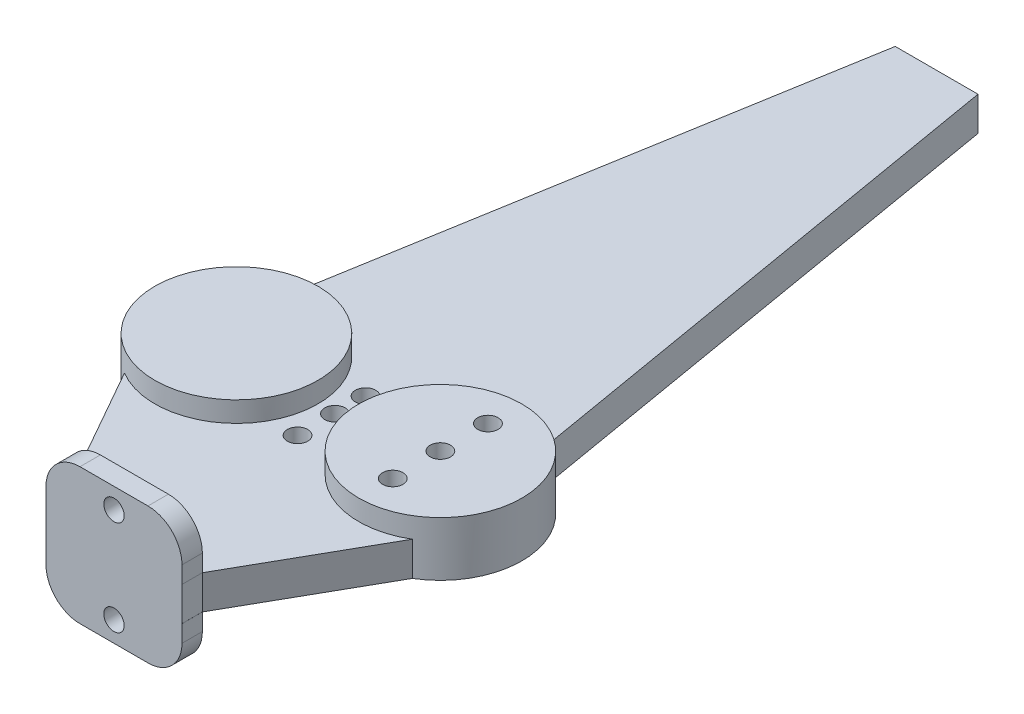
ISO-10303-21;
HEADER;
FILE_DESCRIPTION(('STEP AP214'),'2;1');
FILE_NAME('part.step','',(''),(''),'','','');
FILE_SCHEMA(('AUTOMOTIVE_DESIGN { 1 0 10303 214 1 1 1 1 }'));
ENDSEC;
DATA;
#1=APPLICATION_CONTEXT('core data for automotive mechanical design processes');
#2=APPLICATION_PROTOCOL_DEFINITION('international standard','automotive_design',2000,#1);
#3=PRODUCT_CONTEXT('',#1,'mechanical');
#4=PRODUCT('Part','Part','',(#3));
#5=PRODUCT_RELATED_PRODUCT_CATEGORY('part','',(#4));
#6=PRODUCT_DEFINITION_FORMATION('','',#4);
#7=PRODUCT_DEFINITION_CONTEXT('part definition',#1,'design');
#8=PRODUCT_DEFINITION('design','',#6,#7);
#9=PRODUCT_DEFINITION_SHAPE('','',#8);
#10=(LENGTH_UNIT() NAMED_UNIT(*) SI_UNIT(.MILLI.,.METRE.));
#11=(NAMED_UNIT(*) PLANE_ANGLE_UNIT() SI_UNIT($,.RADIAN.));
#12=(NAMED_UNIT(*) SI_UNIT($,.STERADIAN.) SOLID_ANGLE_UNIT());
#13=UNCERTAINTY_MEASURE_WITH_UNIT(LENGTH_MEASURE(1.E-05),#10,'distance_accuracy_value','');
#14=(GEOMETRIC_REPRESENTATION_CONTEXT(3) GLOBAL_UNCERTAINTY_ASSIGNED_CONTEXT((#13)) GLOBAL_UNIT_ASSIGNED_CONTEXT((#10,
#11,#12)) REPRESENTATION_CONTEXT('',''));
#15=CARTESIAN_POINT('',(0.,0.,0.));
#16=DIRECTION('',(0.,0.,1.));
#17=DIRECTION('',(1.,0.,0.));
#18=AXIS2_PLACEMENT_3D('',#15,#16,#17);
#19=CARTESIAN_POINT('',(0.,0.,62.));
#20=DIRECTION('',(0.,1.,0.));
#21=DIRECTION('',(0.,0.,1.));
#22=AXIS2_PLACEMENT_3D('',#19,#20,#21);
#23=PLANE('',#22);
#24=DIRECTION('',(1.,0.,0.));
#25=VECTOR('',#24,1.);
#26=CARTESIAN_POINT('',(0.,0.,59.));
#27=LINE('',#26,#25);
#28=CARTESIAN_POINT('',(9.98550356432979,0.,59.));
#29=VERTEX_POINT('',#28);
#30=CARTESIAN_POINT('',(9.9927517821649,0.,59.));
#31=VERTEX_POINT('',#30);
#32=EDGE_CURVE('E145',#29,#31,#27,.T.);
#33=ORIENTED_EDGE('',*,*,#32,.F.);
#34=DIRECTION('',(0.,0.,-1.));
#35=VECTOR('',#34,1.);
#36=CARTESIAN_POINT('',(9.98550356432979,0.,62.));
#37=LINE('',#36,#35);
#38=CARTESIAN_POINT('',(9.98550356432979,0.,62.));
#39=VERTEX_POINT('',#38);
#40=EDGE_CURVE('E140',#39,#29,#37,.T.);
#41=ORIENTED_EDGE('',*,*,#40,.F.);
#42=DIRECTION('',(1.,0.,0.));
#43=VECTOR('',#42,1.);
#44=CARTESIAN_POINT('',(0.,0.,62.));
#45=LINE('',#44,#43);
#46=CARTESIAN_POINT('',(9.9927517821649,0.,62.));
#47=VERTEX_POINT('',#46);
#48=EDGE_CURVE('E142',#39,#47,#45,.T.);
#49=ORIENTED_EDGE('',*,*,#48,.T.);
#50=DIRECTION('',(0.,0.,-1.));
#51=VECTOR('',#50,1.);
#52=CARTESIAN_POINT('',(9.9927517821649,0.,62.));
#53=LINE('',#52,#51);
#54=EDGE_CURVE('E195',#47,#31,#53,.T.);
#55=ORIENTED_EDGE('',*,*,#54,.T.);
#56=EDGE_LOOP('',(#33,#41,#49,#55));
#57=FACE_BOUND('',#56,.T.);
#58=ADVANCED_FACE('F50',(#57),#23,.T.);
#59=CARTESIAN_POINT('',(9.98550356432979,0.,62.));
#60=DIRECTION('',(1.,0.,0.));
#61=DIRECTION('',(0.,0.,-1.));
#62=AXIS2_PLACEMENT_3D('',#59,#60,#61);
#63=PLANE('',#62);
#64=DIRECTION('',(0.,-1.,0.));
#65=VECTOR('',#64,1.);
#66=CARTESIAN_POINT('',(9.98550356432979,0.,59.));
#67=LINE('',#66,#65);
#68=CARTESIAN_POINT('',(9.98550356432979,5.,59.));
#69=VERTEX_POINT('',#68);
#70=EDGE_CURVE('E179',#69,#29,#67,.T.);
#71=ORIENTED_EDGE('',*,*,#70,.F.);
#72=DIRECTION('',(0.,0.,-1.));
#73=VECTOR('',#72,1.);
#74=CARTESIAN_POINT('',(9.98550356432979,5.,62.));
#75=LINE('',#74,#73);
#76=CARTESIAN_POINT('',(9.98550356432979,5.,62.));
#77=VERTEX_POINT('',#76);
#78=EDGE_CURVE('E151',#77,#69,#75,.T.);
#79=ORIENTED_EDGE('',*,*,#78,.F.);
#80=DIRECTION('',(0.,-1.,0.));
#81=VECTOR('',#80,1.);
#82=CARTESIAN_POINT('',(9.98550356432979,0.,62.));
#83=LINE('',#82,#81);
#84=EDGE_CURVE('E157',#77,#39,#83,.T.);
#85=ORIENTED_EDGE('',*,*,#84,.T.);
#86=ORIENTED_EDGE('',*,*,#40,.T.);
#87=EDGE_LOOP('',(#71,#79,#85,#86));
#88=FACE_BOUND('',#87,.T.);
#89=ADVANCED_FACE('F163',(#88),#63,.T.);
#90=CARTESIAN_POINT('',(0.,5.,62.));
#91=DIRECTION('',(0.,-1.,0.));
#92=DIRECTION('',(0.,0.,-1.));
#93=AXIS2_PLACEMENT_3D('',#90,#91,#92);
#94=PLANE('',#93);
#95=DIRECTION('',(-1.,0.,0.));
#96=VECTOR('',#95,1.);
#97=CARTESIAN_POINT('',(0.,5.,59.));
#98=LINE('',#97,#96);
#99=CARTESIAN_POINT('',(9.9927517821649,5.,59.));
#100=VERTEX_POINT('',#99);
#101=EDGE_CURVE('E182',#100,#69,#98,.T.);
#102=ORIENTED_EDGE('',*,*,#101,.F.);
#103=DIRECTION('',(0.,0.,-1.));
#104=VECTOR('',#103,1.);
#105=CARTESIAN_POINT('',(9.9927517821649,5.,62.));
#106=LINE('',#105,#104);
#107=CARTESIAN_POINT('',(9.9927517821649,5.,62.));
#108=VERTEX_POINT('',#107);
#109=EDGE_CURVE('E197',#108,#100,#106,.T.);
#110=ORIENTED_EDGE('',*,*,#109,.F.);
#111=DIRECTION('',(-1.,0.,0.));
#112=VECTOR('',#111,1.);
#113=CARTESIAN_POINT('',(0.,5.,62.));
#114=LINE('',#113,#112);
#115=EDGE_CURVE('E164',#108,#77,#114,.T.);
#116=ORIENTED_EDGE('',*,*,#115,.T.);
#117=ORIENTED_EDGE('',*,*,#78,.T.);
#118=EDGE_LOOP('',(#102,#110,#116,#117));
#119=FACE_BOUND('',#118,.T.);
#120=ADVANCED_FACE('F263',(#119),#94,.T.);
#121=CARTESIAN_POINT('',(9.9927517821649,0.,62.));
#122=DIRECTION('',(1.,0.,0.));
#123=DIRECTION('',(0.,0.,-1.));
#124=AXIS2_PLACEMENT_3D('',#121,#122,#123);
#125=PLANE('',#124);
#126=DIRECTION('',(0.,-1.,0.));
#127=VECTOR('',#126,1.);
#128=CARTESIAN_POINT('',(9.9927517821649,0.,59.));
#129=LINE('',#128,#127);
#130=CARTESIAN_POINT('',(9.9927517821649,7.5,59.));
#131=VERTEX_POINT('',#130);
#132=EDGE_CURVE('E185',#131,#100,#129,.T.);
#133=ORIENTED_EDGE('',*,*,#132,.F.);
#134=DIRECTION('',(0.,0.,-1.));
#135=VECTOR('',#134,1.);
#136=CARTESIAN_POINT('',(9.9927517821649,7.5,62.));
#137=LINE('',#136,#135);
#138=CARTESIAN_POINT('',(9.9927517821649,7.5,62.));
#139=VERTEX_POINT('',#138);
#140=EDGE_CURVE('E12',#131,#139,#137,.F.);
#141=ORIENTED_EDGE('',*,*,#140,.T.);
#142=DIRECTION('',(0.,-1.,0.));
#143=VECTOR('',#142,1.);
#144=CARTESIAN_POINT('',(9.9927517821649,0.,62.));
#145=LINE('',#144,#143);
#146=EDGE_CURVE('E166',#139,#108,#145,.T.);
#147=ORIENTED_EDGE('',*,*,#146,.T.);
#148=ORIENTED_EDGE('',*,*,#109,.T.);
#149=EDGE_LOOP('',(#133,#141,#147,#148));
#150=FACE_BOUND('',#149,.T.);
#151=ADVANCED_FACE('F268',(#150),#125,.T.);
#152=CARTESIAN_POINT('',(0.,12.5,62.));
#153=DIRECTION('',(0.,1.,0.));
#154=DIRECTION('',(0.,0.,1.));
#155=AXIS2_PLACEMENT_3D('',#152,#153,#154);
#156=PLANE('',#155);
#157=DIRECTION('',(1.,0.,0.));
#158=VECTOR('',#157,1.);
#159=CARTESIAN_POINT('',(0.,12.5,62.));
#160=LINE('',#159,#158);
#161=CARTESIAN_POINT('',(-5.0072482178351,12.5,62.));
#162=VERTEX_POINT('',#161);
#163=CARTESIAN_POINT('',(4.9927517821649,12.5,62.));
#164=VERTEX_POINT('',#163);
#165=EDGE_CURVE('E171',#162,#164,#160,.T.);
#166=ORIENTED_EDGE('',*,*,#165,.T.);
#167=DIRECTION('',(0.,0.,-1.));
#168=VECTOR('',#167,1.);
#169=CARTESIAN_POINT('',(4.9927517821649,12.5,62.));
#170=LINE('',#169,#168);
#171=CARTESIAN_POINT('',(4.9927517821649,12.5,59.));
#172=VERTEX_POINT('',#171);
#173=EDGE_CURVE('E58',#164,#172,#170,.T.);
#174=ORIENTED_EDGE('',*,*,#173,.T.);
#175=DIRECTION('',(1.,0.,0.));
#176=VECTOR('',#175,1.);
#177=CARTESIAN_POINT('',(0.,12.5,59.));
#178=LINE('',#177,#176);
#179=CARTESIAN_POINT('',(-5.0072482178351,12.5,59.));
#180=VERTEX_POINT('',#179);
#181=EDGE_CURVE('E187',#180,#172,#178,.T.);
#182=ORIENTED_EDGE('',*,*,#181,.F.);
#183=DIRECTION('',(0.,0.,-1.));
#184=VECTOR('',#183,1.);
#185=CARTESIAN_POINT('',(-5.0072482178351,12.5,62.));
#186=LINE('',#185,#184);
#187=EDGE_CURVE('E227',#180,#162,#186,.F.);
#188=ORIENTED_EDGE('',*,*,#187,.T.);
#189=EDGE_LOOP('',(#166,#174,#182,#188));
#190=FACE_BOUND('',#189,.T.);
#191=ADVANCED_FACE('F232',(#190),#156,.T.);
#192=CARTESIAN_POINT('',(-10.0072482178351,0.,62.));
#193=DIRECTION('',(1.,0.,0.));
#194=DIRECTION('',(0.,1.,0.));
#195=AXIS2_PLACEMENT_3D('',#192,#193,#194);
#196=PLANE('',#195);
#197=DIRECTION('',(0.,-1.,0.));
#198=VECTOR('',#197,1.);
#199=CARTESIAN_POINT('',(-10.0072482178351,0.,59.));
#200=LINE('',#199,#198);
#201=CARTESIAN_POINT('',(-10.0072482178351,7.5,59.));
#202=VERTEX_POINT('',#201);
#203=CARTESIAN_POINT('',(-10.0072482178351,-2.5,59.));
#204=VERTEX_POINT('',#203);
#205=EDGE_CURVE('E190',#202,#204,#200,.T.);
#206=ORIENTED_EDGE('',*,*,#205,.T.);
#207=DIRECTION('',(0.,0.,-1.));
#208=VECTOR('',#207,1.);
#209=CARTESIAN_POINT('',(-10.0072482178351,-2.5,62.));
#210=LINE('',#209,#208);
#211=CARTESIAN_POINT('',(-10.0072482178351,-2.5,62.));
#212=VERTEX_POINT('',#211);
#213=EDGE_CURVE('E65',#204,#212,#210,.F.);
#214=ORIENTED_EDGE('',*,*,#213,.T.);
#215=DIRECTION('',(0.,-1.,0.));
#216=VECTOR('',#215,1.);
#217=CARTESIAN_POINT('',(-10.0072482178351,0.,62.));
#218=LINE('',#217,#216);
#219=CARTESIAN_POINT('',(-10.0072482178351,7.5,62.));
#220=VERTEX_POINT('',#219);
#221=EDGE_CURVE('E174',#220,#212,#218,.T.);
#222=ORIENTED_EDGE('',*,*,#221,.F.);
#223=DIRECTION('',(0.,0.,-1.));
#224=VECTOR('',#223,1.);
#225=CARTESIAN_POINT('',(-10.0072482178351,7.5,59.));
#226=LINE('',#225,#224);
#227=EDGE_CURVE('E223',#220,#202,#226,.T.);
#228=ORIENTED_EDGE('',*,*,#227,.T.);
#229=EDGE_LOOP('',(#206,#214,#222,#228));
#230=FACE_BOUND('',#229,.T.);
#231=ADVANCED_FACE('F243',(#230),#196,.F.);
#232=CARTESIAN_POINT('',(0.,-7.5,62.));
#233=DIRECTION('',(0.,1.,0.));
#234=DIRECTION('',(0.,0.,1.));
#235=AXIS2_PLACEMENT_3D('',#232,#233,#234);
#236=PLANE('',#235);
#237=DIRECTION('',(1.,0.,0.));
#238=VECTOR('',#237,1.);
#239=CARTESIAN_POINT('',(0.,-7.5,59.));
#240=LINE('',#239,#238);
#241=CARTESIAN_POINT('',(-5.0072482178351,-7.5,59.));
#242=VERTEX_POINT('',#241);
#243=CARTESIAN_POINT('',(4.9927517821649,-7.5,59.));
#244=VERTEX_POINT('',#243);
#245=EDGE_CURVE('E192',#242,#244,#240,.T.);
#246=ORIENTED_EDGE('',*,*,#245,.T.);
#247=DIRECTION('',(0.,0.,-1.));
#248=VECTOR('',#247,1.);
#249=CARTESIAN_POINT('',(4.9927517821649,-7.5,62.));
#250=LINE('',#249,#248);
#251=CARTESIAN_POINT('',(4.9927517821649,-7.5,62.));
#252=VERTEX_POINT('',#251);
#253=EDGE_CURVE('E214',#244,#252,#250,.F.);
#254=ORIENTED_EDGE('',*,*,#253,.T.);
#255=DIRECTION('',(1.,0.,0.));
#256=VECTOR('',#255,1.);
#257=CARTESIAN_POINT('',(0.,-7.5,62.));
#258=LINE('',#257,#256);
#259=CARTESIAN_POINT('',(-5.0072482178351,-7.5,62.));
#260=VERTEX_POINT('',#259);
#261=EDGE_CURVE('E176',#260,#252,#258,.T.);
#262=ORIENTED_EDGE('',*,*,#261,.F.);
#263=DIRECTION('',(0.,0.,-1.));
#264=VECTOR('',#263,1.);
#265=CARTESIAN_POINT('',(-5.0072482178351,-7.5,62.));
#266=LINE('',#265,#264);
#267=EDGE_CURVE('E211',#260,#242,#266,.T.);
#268=ORIENTED_EDGE('',*,*,#267,.T.);
#269=EDGE_LOOP('',(#246,#254,#262,#268));
#270=FACE_BOUND('',#269,.T.);
#271=ADVANCED_FACE('F251',(#270),#236,.F.);
#272=CARTESIAN_POINT('',(9.9927517821649,-2.5,62.));
#273=VERTEX_POINT('',#272);
#274=EDGE_CURVE('E160',#47,#273,#145,.T.);
#275=ORIENTED_EDGE('',*,*,#274,.T.);
#276=DIRECTION('',(0.,0.,-1.));
#277=VECTOR('',#276,1.);
#278=CARTESIAN_POINT('',(9.9927517821649,-2.5,59.));
#279=LINE('',#278,#277);
#280=CARTESIAN_POINT('',(9.9927517821649,-2.5,59.));
#281=VERTEX_POINT('',#280);
#282=EDGE_CURVE('E150',#273,#281,#279,.T.);
#283=ORIENTED_EDGE('',*,*,#282,.T.);
#284=EDGE_CURVE('E161',#31,#281,#129,.T.);
#285=ORIENTED_EDGE('',*,*,#284,.F.);
#286=ORIENTED_EDGE('',*,*,#54,.F.);
#287=EDGE_LOOP('',(#275,#283,#285,#286));
#288=FACE_BOUND('',#287,.T.);
#289=ADVANCED_FACE('F259',(#288),#125,.T.);
#290=CARTESIAN_POINT('',(0.,0.,62.));
#291=DIRECTION('',(0.,0.,1.));
#292=DIRECTION('',(1.,0.,0.));
#293=AXIS2_PLACEMENT_3D('',#290,#291,#292);
#294=PLANE('',#293);
#295=CARTESIAN_POINT('',(-0.00724821783510202,9.5,62.));
#296=DIRECTION('',(0.,0.,1.));
#297=DIRECTION('',(1.,0.,0.));
#298=AXIS2_PLACEMENT_3D('',#295,#296,#297);
#299=CIRCLE('',#298,1.49999999999999);
#300=CARTESIAN_POINT('',(1.49275178216489,9.5,62.));
#301=VERTEX_POINT('',#300);
#302=EDGE_CURVE('E322',#301,#301,#299,.T.);
#303=ORIENTED_EDGE('',*,*,#302,.F.);
#304=EDGE_LOOP('',(#303));
#305=FACE_BOUND('',#304,.T.);
#306=CARTESIAN_POINT('',(-0.00724821783510202,-4.5,62.));
#307=DIRECTION('',(0.,0.,1.));
#308=DIRECTION('',(1.,0.,0.));
#309=AXIS2_PLACEMENT_3D('',#306,#307,#308);
#310=CIRCLE('',#309,1.49999999999999);
#311=CARTESIAN_POINT('',(1.49275178216489,-4.5,62.));
#312=VERTEX_POINT('',#311);
#313=EDGE_CURVE('E180',#312,#312,#310,.T.);
#314=ORIENTED_EDGE('',*,*,#313,.F.);
#315=EDGE_LOOP('',(#314));
#316=FACE_BOUND('',#315,.T.);
#317=ORIENTED_EDGE('',*,*,#261,.T.);
#318=CARTESIAN_POINT('',(4.9927517821649,-2.5,62.));
#319=DIRECTION('',(0.,0.,1.));
#320=DIRECTION('',(1.,0.,0.));
#321=AXIS2_PLACEMENT_3D('',#318,#319,#320);
#322=CIRCLE('',#321,5.);
#323=EDGE_CURVE('E221',#252,#273,#322,.T.);
#324=ORIENTED_EDGE('',*,*,#323,.T.);
#325=ORIENTED_EDGE('',*,*,#274,.F.);
#326=ORIENTED_EDGE('',*,*,#48,.F.);
#327=ORIENTED_EDGE('',*,*,#84,.F.);
#328=ORIENTED_EDGE('',*,*,#115,.F.);
#329=ORIENTED_EDGE('',*,*,#146,.F.);
#330=CARTESIAN_POINT('',(4.9927517821649,7.5,62.));
#331=DIRECTION('',(0.,0.,1.));
#332=DIRECTION('',(1.,0.,0.));
#333=AXIS2_PLACEMENT_3D('',#330,#331,#332);
#334=CIRCLE('',#333,5.);
#335=EDGE_CURVE('E217',#139,#164,#334,.T.);
#336=ORIENTED_EDGE('',*,*,#335,.T.);
#337=ORIENTED_EDGE('',*,*,#165,.F.);
#338=CARTESIAN_POINT('',(-5.0072482178351,7.5,62.));
#339=DIRECTION('',(0.,0.,1.));
#340=DIRECTION('',(1.,0.,0.));
#341=AXIS2_PLACEMENT_3D('',#338,#339,#340);
#342=CIRCLE('',#341,5.);
#343=EDGE_CURVE('E72',#162,#220,#342,.T.);
#344=ORIENTED_EDGE('',*,*,#343,.T.);
#345=ORIENTED_EDGE('',*,*,#221,.T.);
#346=CARTESIAN_POINT('',(-5.0072482178351,-2.5,62.));
#347=DIRECTION('',(0.,0.,1.));
#348=DIRECTION('',(1.,0.,0.));
#349=AXIS2_PLACEMENT_3D('',#346,#347,#348);
#350=CIRCLE('',#349,5.);
#351=EDGE_CURVE('E219',#212,#260,#350,.T.);
#352=ORIENTED_EDGE('',*,*,#351,.T.);
#353=EDGE_LOOP('',(#317,#324,#325,#326,#327,#328,#329,#336,#337,#344,#345,#352));
#354=FACE_BOUND('',#353,.T.);
#355=ADVANCED_FACE('F155',(#305,#316,#354),#294,.T.);
#356=CARTESIAN_POINT('',(0.,0.,59.));
#357=DIRECTION('',(0.,0.,1.));
#358=DIRECTION('',(1.,0.,0.));
#359=AXIS2_PLACEMENT_3D('',#356,#357,#358);
#360=PLANE('',#359);
#361=CARTESIAN_POINT('',(-0.00724821783510202,9.5,59.));
#362=DIRECTION('',(0.,0.,-1.));
#363=DIRECTION('',(-1.,0.,0.));
#364=AXIS2_PLACEMENT_3D('',#361,#362,#363);
#365=CIRCLE('',#364,1.49999999999999);
#366=CARTESIAN_POINT('',(-1.50724821783509,9.5,59.));
#367=VERTEX_POINT('',#366);
#368=EDGE_CURVE('E318',#367,#367,#365,.T.);
#369=ORIENTED_EDGE('',*,*,#368,.F.);
#370=EDGE_LOOP('',(#369));
#371=FACE_BOUND('',#370,.T.);
#372=CARTESIAN_POINT('',(-0.00724821783510202,-4.5,59.));
#373=DIRECTION('',(0.,0.,-1.));
#374=DIRECTION('',(-1.,0.,0.));
#375=AXIS2_PLACEMENT_3D('',#372,#373,#374);
#376=CIRCLE('',#375,1.49999999999999);
#377=CARTESIAN_POINT('',(-1.50724821783509,-4.5,59.));
#378=VERTEX_POINT('',#377);
#379=EDGE_CURVE('E321',#378,#378,#376,.T.);
#380=ORIENTED_EDGE('',*,*,#379,.F.);
#381=EDGE_LOOP('',(#380));
#382=FACE_BOUND('',#381,.T.);
#383=ORIENTED_EDGE('',*,*,#284,.T.);
#384=CARTESIAN_POINT('',(4.9927517821649,-2.5,59.));
#385=DIRECTION('',(0.,0.,1.));
#386=DIRECTION('',(1.,0.,0.));
#387=AXIS2_PLACEMENT_3D('',#384,#385,#386);
#388=CIRCLE('',#387,5.);
#389=EDGE_CURVE('E209',#281,#244,#388,.F.);
#390=ORIENTED_EDGE('',*,*,#389,.T.);
#391=ORIENTED_EDGE('',*,*,#245,.F.);
#392=CARTESIAN_POINT('',(-5.0072482178351,-2.5,59.));
#393=DIRECTION('',(0.,0.,1.));
#394=DIRECTION('',(1.,0.,0.));
#395=AXIS2_PLACEMENT_3D('',#392,#393,#394);
#396=CIRCLE('',#395,5.);
#397=EDGE_CURVE('E207',#242,#204,#396,.F.);
#398=ORIENTED_EDGE('',*,*,#397,.T.);
#399=ORIENTED_EDGE('',*,*,#205,.F.);
#400=CARTESIAN_POINT('',(-5.0072482178351,7.5,59.));
#401=DIRECTION('',(0.,0.,1.));
#402=DIRECTION('',(1.,0.,0.));
#403=AXIS2_PLACEMENT_3D('',#400,#401,#402);
#404=CIRCLE('',#403,5.);
#405=EDGE_CURVE('E203',#202,#180,#404,.F.);
#406=ORIENTED_EDGE('',*,*,#405,.T.);
#407=ORIENTED_EDGE('',*,*,#181,.T.);
#408=CARTESIAN_POINT('',(4.9927517821649,7.5,59.));
#409=DIRECTION('',(0.,0.,1.));
#410=DIRECTION('',(1.,0.,0.));
#411=AXIS2_PLACEMENT_3D('',#408,#409,#410);
#412=CIRCLE('',#411,5.);
#413=EDGE_CURVE('E205',#172,#131,#412,.F.);
#414=ORIENTED_EDGE('',*,*,#413,.T.);
#415=ORIENTED_EDGE('',*,*,#132,.T.);
#416=ORIENTED_EDGE('',*,*,#101,.T.);
#417=ORIENTED_EDGE('',*,*,#70,.T.);
#418=ORIENTED_EDGE('',*,*,#32,.T.);
#419=EDGE_LOOP('',(#383,#390,#391,#398,#399,#406,#407,#414,#415,#416,#417,#418));
#420=FACE_BOUND('',#419,.T.);
#421=ADVANCED_FACE('F238',(#371,#382,#420),#360,.F.);
#422=CARTESIAN_POINT('',(4.9927517821649,-2.5,62.));
#423=DIRECTION('',(0.,0.,1.));
#424=DIRECTION('',(1.,0.,0.));
#425=AXIS2_PLACEMENT_3D('',#422,#423,#424);
#426=CYLINDRICAL_SURFACE('',#425,5.);
#427=ORIENTED_EDGE('',*,*,#323,.F.);
#428=ORIENTED_EDGE('',*,*,#253,.F.);
#429=ORIENTED_EDGE('',*,*,#389,.F.);
#430=ORIENTED_EDGE('',*,*,#282,.F.);
#431=EDGE_LOOP('',(#427,#428,#429,#430));
#432=FACE_BOUND('',#431,.T.);
#433=ADVANCED_FACE('F257',(#432),#426,.T.);
#434=CARTESIAN_POINT('',(-5.0072482178351,-2.5,62.));
#435=DIRECTION('',(0.,0.,-1.));
#436=DIRECTION('',(-1.,0.,0.));
#437=AXIS2_PLACEMENT_3D('',#434,#435,#436);
#438=CYLINDRICAL_SURFACE('',#437,5.);
#439=ORIENTED_EDGE('',*,*,#351,.F.);
#440=ORIENTED_EDGE('',*,*,#213,.F.);
#441=ORIENTED_EDGE('',*,*,#397,.F.);
#442=ORIENTED_EDGE('',*,*,#267,.F.);
#443=EDGE_LOOP('',(#439,#440,#441,#442));
#444=FACE_BOUND('',#443,.T.);
#445=ADVANCED_FACE('F248',(#444),#438,.T.);
#446=CARTESIAN_POINT('',(4.9927517821649,7.5,62.));
#447=DIRECTION('',(0.,0.,-1.));
#448=DIRECTION('',(-1.,0.,0.));
#449=AXIS2_PLACEMENT_3D('',#446,#447,#448);
#450=CYLINDRICAL_SURFACE('',#449,5.);
#451=ORIENTED_EDGE('',*,*,#335,.F.);
#452=ORIENTED_EDGE('',*,*,#140,.F.);
#453=ORIENTED_EDGE('',*,*,#413,.F.);
#454=ORIENTED_EDGE('',*,*,#173,.F.);
#455=EDGE_LOOP('',(#451,#452,#453,#454));
#456=FACE_BOUND('',#455,.T.);
#457=ADVANCED_FACE('F267',(#456),#450,.T.);
#458=CARTESIAN_POINT('',(-5.0072482178351,7.5,62.));
#459=DIRECTION('',(0.,0.,1.));
#460=DIRECTION('',(1.,0.,0.));
#461=AXIS2_PLACEMENT_3D('',#458,#459,#460);
#462=CYLINDRICAL_SURFACE('',#461,5.);
#463=ORIENTED_EDGE('',*,*,#343,.F.);
#464=ORIENTED_EDGE('',*,*,#187,.F.);
#465=ORIENTED_EDGE('',*,*,#405,.F.);
#466=ORIENTED_EDGE('',*,*,#227,.F.);
#467=EDGE_LOOP('',(#463,#464,#465,#466));
#468=FACE_BOUND('',#467,.T.);
#469=ADVANCED_FACE('F52',(#468),#462,.T.);
#470=CARTESIAN_POINT('',(-0.00724821783510202,-4.5,59.));
#471=DIRECTION('',(0.,0.,-1.));
#472=DIRECTION('',(-1.,0.,0.));
#473=AXIS2_PLACEMENT_3D('',#470,#471,#472);
#474=CYLINDRICAL_SURFACE('',#473,1.49999999999999);
#475=ORIENTED_EDGE('',*,*,#313,.T.);
#476=EDGE_LOOP('',(#475));
#477=FACE_BOUND('',#476,.T.);
#478=ORIENTED_EDGE('',*,*,#379,.T.);
#479=EDGE_LOOP('',(#478));
#480=FACE_BOUND('',#479,.T.);
#481=ADVANCED_FACE('F294',(#477,#480),#474,.F.);
#482=CARTESIAN_POINT('',(-0.00724821783510202,9.5,59.));
#483=DIRECTION('',(0.,0.,-1.));
#484=DIRECTION('',(-1.,0.,0.));
#485=AXIS2_PLACEMENT_3D('',#482,#483,#484);
#486=CYLINDRICAL_SURFACE('',#485,1.49999999999999);
#487=ORIENTED_EDGE('',*,*,#302,.T.);
#488=EDGE_LOOP('',(#487));
#489=FACE_BOUND('',#488,.T.);
#490=ORIENTED_EDGE('',*,*,#368,.T.);
#491=EDGE_LOOP('',(#490));
#492=FACE_BOUND('',#491,.T.);
#493=ADVANCED_FACE('F298',(#489,#492),#486,.F.);
#494=CLOSED_SHELL('',(#58,#89,#120,#151,#191,#231,#271,#289,#355,#421,#433,#445,#457,#469,#481,#493));
#495=MANIFOLD_SOLID_BREP('B2',#494);
#496=CARTESIAN_POINT('',(-32.8763666947014,5.,18.6299411269975));
#497=DIRECTION('',(0.870022185848612,0.,-0.49301257198088));
#498=DIRECTION('',(-0.49301257198088,0.,-0.870022185848612));
#499=AXIS2_PLACEMENT_3D('',#496,#497,#498);
#500=PLANE('',#499);
#501=DIRECTION('',(0.49301257198088,0.,0.870022185848612));
#502=VECTOR('',#501,1.);
#503=CARTESIAN_POINT('',(-32.8763666947014,0.,18.6299411269975));
#504=LINE('',#503,#502);
#505=CARTESIAN_POINT('',(-21.1665264928511,0.,39.2943650126157));
#506=VERTEX_POINT('',#505);
#507=CARTESIAN_POINT('',(-9.99999999999999,0.,59.));
#508=VERTEX_POINT('',#507);
#509=EDGE_CURVE('E532',#506,#508,#504,.T.);
#510=ORIENTED_EDGE('',*,*,#509,.T.);
#511=DIRECTION('',(0.,-1.,0.));
#512=VECTOR('',#511,1.);
#513=CARTESIAN_POINT('',(-9.99999999999999,5.,59.));
#514=LINE('',#513,#512);
#515=CARTESIAN_POINT('',(-9.99999999999999,5.,59.));
#516=VERTEX_POINT('',#515);
#517=EDGE_CURVE('E574',#516,#508,#514,.T.);
#518=ORIENTED_EDGE('',*,*,#517,.F.);
#519=DIRECTION('',(0.49301257198088,0.,0.870022185848612));
#520=VECTOR('',#519,1.);
#521=CARTESIAN_POINT('',(-32.8763666947014,5.,18.6299411269975));
#522=LINE('',#521,#520);
#523=CARTESIAN_POINT('',(-21.1665264928511,5.,39.2943650126157));
#524=VERTEX_POINT('',#523);
#525=EDGE_CURVE('E558',#524,#516,#522,.T.);
#526=ORIENTED_EDGE('',*,*,#525,.F.);
#527=DIRECTION('',(0.,-1.,0.));
#528=VECTOR('',#527,1.);
#529=CARTESIAN_POINT('',(-21.1665264928511,5.,39.2943650126157));
#530=LINE('',#529,#528);
#531=EDGE_CURVE('E528',#524,#506,#530,.T.);
#532=ORIENTED_EDGE('',*,*,#531,.T.);
#533=EDGE_LOOP('',(#510,#518,#526,#532));
#534=FACE_BOUND('',#533,.T.);
#535=ADVANCED_FACE('F426',(#534),#500,.F.);
#536=CARTESIAN_POINT('',(0.,5.,59.));
#537=DIRECTION('',(0.,0.,-1.));
#538=DIRECTION('',(-1.,0.,0.));
#539=AXIS2_PLACEMENT_3D('',#536,#537,#538);
#540=PLANE('',#539);
#541=DIRECTION('',(1.,0.,0.));
#542=VECTOR('',#541,1.);
#543=CARTESIAN_POINT('',(0.,0.,59.));
#544=LINE('',#543,#542);
#545=CARTESIAN_POINT('',(10.,0.,59.));
#546=VERTEX_POINT('',#545);
#547=EDGE_CURVE('E536',#508,#546,#544,.T.);
#548=ORIENTED_EDGE('',*,*,#547,.T.);
#549=DIRECTION('',(0.,-1.,0.));
#550=VECTOR('',#549,1.);
#551=CARTESIAN_POINT('',(10.,5.,59.));
#552=LINE('',#551,#550);
#553=CARTESIAN_POINT('',(10.,5.,59.));
#554=VERTEX_POINT('',#553);
#555=EDGE_CURVE('E571',#554,#546,#552,.T.);
#556=ORIENTED_EDGE('',*,*,#555,.F.);
#557=DIRECTION('',(1.,0.,0.));
#558=VECTOR('',#557,1.);
#559=CARTESIAN_POINT('',(0.,5.,59.));
#560=LINE('',#559,#558);
#561=EDGE_CURVE('E488',#516,#554,#560,.T.);
#562=ORIENTED_EDGE('',*,*,#561,.F.);
#563=ORIENTED_EDGE('',*,*,#517,.T.);
#564=EDGE_LOOP('',(#548,#556,#562,#563));
#565=FACE_BOUND('',#564,.T.);
#566=ADVANCED_FACE('F650',(#565),#540,.F.);
#567=CARTESIAN_POINT('',(32.8763666947013,5.,18.6299411269971));
#568=DIRECTION('',(0.870022185848616,0.,0.493012571980874));
#569=DIRECTION('',(0.493012571980874,0.,-0.870022185848616));
#570=AXIS2_PLACEMENT_3D('',#567,#568,#569);
#571=PLANE('',#570);
#572=DIRECTION('',(-0.493012571980874,0.,0.870022185848616));
#573=VECTOR('',#572,1.);
#574=CARTESIAN_POINT('',(32.8763666947013,0.,18.6299411269971));
#575=LINE('',#574,#573);
#576=CARTESIAN_POINT('',(21.166526492851,0.,39.2943650126157));
#577=VERTEX_POINT('',#576);
#578=EDGE_CURVE('E541',#577,#546,#575,.T.);
#579=ORIENTED_EDGE('',*,*,#578,.F.);
#580=DIRECTION('',(0.,-1.,0.));
#581=VECTOR('',#580,1.);
#582=CARTESIAN_POINT('',(21.166526492851,5.,39.2943650126157));
#583=LINE('',#582,#581);
#584=CARTESIAN_POINT('',(21.1665264928509,5.,39.2943650126157));
#585=VERTEX_POINT('',#584);
#586=EDGE_CURVE('E568',#585,#577,#583,.T.);
#587=ORIENTED_EDGE('',*,*,#586,.F.);
#588=DIRECTION('',(-0.493012571980874,0.,0.870022185848616));
#589=VECTOR('',#588,1.);
#590=CARTESIAN_POINT('',(32.8763666947013,5.,18.6299411269971));
#591=LINE('',#590,#589);
#592=EDGE_CURVE('E520',#585,#554,#591,.T.);
#593=ORIENTED_EDGE('',*,*,#592,.T.);
#594=ORIENTED_EDGE('',*,*,#555,.T.);
#595=EDGE_LOOP('',(#579,#587,#593,#594));
#596=FACE_BOUND('',#595,.T.);
#597=ADVANCED_FACE('F635',(#596),#571,.T.);
#598=CARTESIAN_POINT('',(15.,5.,29.));
#599=DIRECTION('',(0.,-1.,0.));
#600=DIRECTION('',(0.,0.,-1.));
#601=AXIS2_PLACEMENT_3D('',#598,#599,#600);
#602=CYLINDRICAL_SURFACE('',#601,12.);
#603=CARTESIAN_POINT('',(15.,0.,29.));
#604=DIRECTION('',(0.,1.,0.));
#605=DIRECTION('',(0.,0.,1.));
#606=AXIS2_PLACEMENT_3D('',#603,#604,#605);
#607=CIRCLE('',#606,12.);
#608=CARTESIAN_POINT('',(19.1684611875596,0.,17.747270049992));
#609=VERTEX_POINT('',#608);
#610=EDGE_CURVE('E545',#577,#609,#607,.T.);
#611=ORIENTED_EDGE('',*,*,#610,.T.);
#612=DIRECTION('',(0.,-1.,0.));
#613=VECTOR('',#612,1.);
#614=CARTESIAN_POINT('',(19.1684611875596,5.,17.747270049992));
#615=LINE('',#614,#613);
#616=CARTESIAN_POINT('',(19.1684611875596,5.,17.747270049992));
#617=VERTEX_POINT('',#616);
#618=EDGE_CURVE('E510',#617,#609,#615,.T.);
#619=ORIENTED_EDGE('',*,*,#618,.F.);
#620=CARTESIAN_POINT('',(15.,5.,29.));
#621=DIRECTION('',(0.,1.,0.));
#622=DIRECTION('',(0.,0.,1.));
#623=AXIS2_PLACEMENT_3D('',#620,#621,#622);
#624=CIRCLE('',#623,11.9999999999999);
#625=EDGE_CURVE('E436',#617,#585,#624,.T.);
#626=ORIENTED_EDGE('',*,*,#625,.T.);
#627=ORIENTED_EDGE('',*,*,#586,.T.);
#628=EDGE_LOOP('',(#611,#619,#626,#627));
#629=FACE_BOUND('',#628,.T.);
#630=CARTESIAN_POINT('',(15.,8.,29.));
#631=DIRECTION('',(0.,1.,0.));
#632=DIRECTION('',(0.,0.,1.));
#633=AXIS2_PLACEMENT_3D('',#630,#631,#632);
#634=CIRCLE('',#633,11.9999999999999);
#635=CARTESIAN_POINT('',(15.,8.,41.));
#636=VERTEX_POINT('',#635);
#637=EDGE_CURVE('E537',#636,#636,#634,.T.);
#638=ORIENTED_EDGE('',*,*,#637,.F.);
#639=EDGE_LOOP('',(#638));
#640=FACE_BOUND('',#639,.T.);
#641=ADVANCED_FACE('F661',(#629,#640),#602,.T.);
#642=CARTESIAN_POINT('',(15.6875601669558,5.,-2.67401593754936));
#643=DIRECTION('',(0.985781716034392,0.,-0.168030974324049));
#644=DIRECTION('',(-0.168030974324049,0.,-0.985781716034392));
#645=AXIS2_PLACEMENT_3D('',#642,#643,#644);
#646=PLANE('',#645);
#647=DIRECTION('',(0.168030974324049,0.,0.985781716034392));
#648=VECTOR('',#647,1.);
#649=CARTESIAN_POINT('',(15.6875601669558,0.,-2.67401593754936));
#650=LINE('',#649,#648);
#651=CARTESIAN_POINT('',(6.08654015631057,0.,-59.));
#652=VERTEX_POINT('',#651);
#653=EDGE_CURVE('E504',#652,#609,#650,.T.);
#654=ORIENTED_EDGE('',*,*,#653,.F.);
#655=DIRECTION('',(0.,-1.,0.));
#656=VECTOR('',#655,1.);
#657=CARTESIAN_POINT('',(6.08654015631057,5.,-59.));
#658=LINE('',#657,#656);
#659=CARTESIAN_POINT('',(6.08654015631057,5.,-59.));
#660=VERTEX_POINT('',#659);
#661=EDGE_CURVE('E499',#660,#652,#658,.T.);
#662=ORIENTED_EDGE('',*,*,#661,.F.);
#663=DIRECTION('',(0.168030974324049,0.,0.985781716034392));
#664=VECTOR('',#663,1.);
#665=CARTESIAN_POINT('',(15.6875601669558,5.,-2.67401593754936));
#666=LINE('',#665,#664);
#667=EDGE_CURVE('E502',#660,#617,#666,.T.);
#668=ORIENTED_EDGE('',*,*,#667,.T.);
#669=ORIENTED_EDGE('',*,*,#618,.T.);
#670=EDGE_LOOP('',(#654,#662,#668,#669));
#671=FACE_BOUND('',#670,.T.);
#672=ADVANCED_FACE('F501',(#671),#646,.T.);
#673=CARTESIAN_POINT('',(0.,5.,-59.));
#674=DIRECTION('',(0.,0.,-1.));
#675=DIRECTION('',(-1.,0.,0.));
#676=AXIS2_PLACEMENT_3D('',#673,#674,#675);
#677=PLANE('',#676);
#678=DIRECTION('',(1.,0.,0.));
#679=VECTOR('',#678,1.);
#680=CARTESIAN_POINT('',(0.,0.,-59.));
#681=LINE('',#680,#679);
#682=CARTESIAN_POINT('',(-6.0865401563105,0.,-59.));
#683=VERTEX_POINT('',#682);
#684=EDGE_CURVE('E551',#683,#652,#681,.T.);
#685=ORIENTED_EDGE('',*,*,#684,.F.);
#686=DIRECTION('',(0.,-1.,0.));
#687=VECTOR('',#686,1.);
#688=CARTESIAN_POINT('',(-6.0865401563105,5.,-59.));
#689=LINE('',#688,#687);
#690=CARTESIAN_POINT('',(-6.0865401563105,5.,-59.));
#691=VERTEX_POINT('',#690);
#692=EDGE_CURVE('E511',#691,#683,#689,.T.);
#693=ORIENTED_EDGE('',*,*,#692,.F.);
#694=DIRECTION('',(1.,0.,0.));
#695=VECTOR('',#694,1.);
#696=CARTESIAN_POINT('',(0.,5.,-59.));
#697=LINE('',#696,#695);
#698=EDGE_CURVE('E515',#691,#660,#697,.T.);
#699=ORIENTED_EDGE('',*,*,#698,.T.);
#700=ORIENTED_EDGE('',*,*,#661,.T.);
#701=EDGE_LOOP('',(#685,#693,#699,#700));
#702=FACE_BOUND('',#701,.T.);
#703=ADVANCED_FACE('F522',(#702),#677,.T.);
#704=CARTESIAN_POINT('',(-15.6875601669555,5.,-2.67401593754923));
#705=DIRECTION('',(0.985781716034393,0.,0.168030974324044));
#706=DIRECTION('',(0.168030974324044,0.,-0.985781716034393));
#707=AXIS2_PLACEMENT_3D('',#704,#705,#706);
#708=PLANE('',#707);
#709=DIRECTION('',(-0.168030974324044,0.,0.985781716034393));
#710=VECTOR('',#709,1.);
#711=CARTESIAN_POINT('',(-15.6875601669555,0.,-2.67401593754923));
#712=LINE('',#711,#710);
#713=CARTESIAN_POINT('',(-19.1684611875591,0.,17.7472700499917));
#714=VERTEX_POINT('',#713);
#715=EDGE_CURVE('E473',#683,#714,#712,.T.);
#716=ORIENTED_EDGE('',*,*,#715,.T.);
#717=DIRECTION('',(0.,-1.,0.));
#718=VECTOR('',#717,1.);
#719=CARTESIAN_POINT('',(-19.1684611875591,5.,17.7472700499917));
#720=LINE('',#719,#718);
#721=CARTESIAN_POINT('',(-19.1684611875591,5.,17.7472700499917));
#722=VERTEX_POINT('',#721);
#723=EDGE_CURVE('E561',#722,#714,#720,.T.);
#724=ORIENTED_EDGE('',*,*,#723,.F.);
#725=DIRECTION('',(-0.168030974324044,0.,0.985781716034393));
#726=VECTOR('',#725,1.);
#727=CARTESIAN_POINT('',(-15.6875601669555,5.,-2.67401593754923));
#728=LINE('',#727,#726);
#729=EDGE_CURVE('E525',#691,#722,#728,.T.);
#730=ORIENTED_EDGE('',*,*,#729,.F.);
#731=ORIENTED_EDGE('',*,*,#692,.T.);
#732=EDGE_LOOP('',(#716,#724,#730,#731));
#733=FACE_BOUND('',#732,.T.);
#734=ADVANCED_FACE('F640',(#733),#708,.F.);
#735=CARTESIAN_POINT('',(-15.,5.,29.));
#736=DIRECTION('',(0.,-1.,0.));
#737=DIRECTION('',(0.,0.,-1.));
#738=AXIS2_PLACEMENT_3D('',#735,#736,#737);
#739=CYLINDRICAL_SURFACE('',#738,12.);
#740=CARTESIAN_POINT('',(-15.,0.,29.));
#741=DIRECTION('',(0.,1.,0.));
#742=DIRECTION('',(0.,0.,1.));
#743=AXIS2_PLACEMENT_3D('',#740,#741,#742);
#744=CIRCLE('',#743,12.);
#745=EDGE_CURVE('E479',#714,#506,#744,.T.);
#746=ORIENTED_EDGE('',*,*,#745,.T.);
#747=ORIENTED_EDGE('',*,*,#531,.F.);
#748=CARTESIAN_POINT('',(-15.,5.,29.));
#749=DIRECTION('',(0.,1.,0.));
#750=DIRECTION('',(0.,0.,1.));
#751=AXIS2_PLACEMENT_3D('',#748,#749,#750);
#752=CIRCLE('',#751,12.);
#753=EDGE_CURVE('E48',#722,#524,#752,.F.);
#754=ORIENTED_EDGE('',*,*,#753,.F.);
#755=ORIENTED_EDGE('',*,*,#723,.T.);
#756=EDGE_LOOP('',(#746,#747,#754,#755));
#757=FACE_BOUND('',#756,.T.);
#758=CARTESIAN_POINT('',(-15.,8.,29.));
#759=DIRECTION('',(0.,1.,0.));
#760=DIRECTION('',(0.,0.,1.));
#761=AXIS2_PLACEMENT_3D('',#758,#759,#760);
#762=CIRCLE('',#761,12.);
#763=CARTESIAN_POINT('',(-15.,8.,41.));
#764=VERTEX_POINT('',#763);
#765=EDGE_CURVE('E618',#764,#764,#762,.T.);
#766=ORIENTED_EDGE('',*,*,#765,.F.);
#767=EDGE_LOOP('',(#766));
#768=FACE_BOUND('',#767,.T.);
#769=ADVANCED_FACE('F637',(#757,#768),#739,.T.);
#770=CARTESIAN_POINT('',(0.,5.,0.));
#771=DIRECTION('',(0.,1.,0.));
#772=DIRECTION('',(0.,0.,1.));
#773=AXIS2_PLACEMENT_3D('',#770,#771,#772);
#774=PLANE('',#773);
#775=CARTESIAN_POINT('',(-0.501479881900781,5.,29.));
#776=DIRECTION('',(0.,1.,0.));
#777=DIRECTION('',(0.,0.,1.));
#778=AXIS2_PLACEMENT_3D('',#775,#776,#777);
#779=CIRCLE('',#778,1.49999999999999);
#780=CARTESIAN_POINT('',(-0.501479881900781,5.,30.5));
#781=VERTEX_POINT('',#780);
#782=EDGE_CURVE('E586',#781,#781,#779,.T.);
#783=ORIENTED_EDGE('',*,*,#782,.F.);
#784=EDGE_LOOP('',(#783));
#785=FACE_BOUND('',#784,.T.);
#786=CARTESIAN_POINT('',(-0.501479881900781,5.,34.505145));
#787=DIRECTION('',(0.,1.,0.));
#788=DIRECTION('',(0.,0.,1.));
#789=AXIS2_PLACEMENT_3D('',#786,#787,#788);
#790=CIRCLE('',#789,1.49999999999999);
#791=CARTESIAN_POINT('',(-0.501479881900781,5.,36.005145));
#792=VERTEX_POINT('',#791);
#793=EDGE_CURVE('E582',#792,#792,#790,.T.);
#794=ORIENTED_EDGE('',*,*,#793,.F.);
#795=EDGE_LOOP('',(#794));
#796=FACE_BOUND('',#795,.T.);
#797=CARTESIAN_POINT('',(-0.501479881900781,5.,24.505145));
#798=DIRECTION('',(0.,1.,0.));
#799=DIRECTION('',(0.,0.,1.));
#800=AXIS2_PLACEMENT_3D('',#797,#798,#799);
#801=CIRCLE('',#800,1.49999999999999);
#802=CARTESIAN_POINT('',(-0.501479881900781,5.,26.005145));
#803=VERTEX_POINT('',#802);
#804=EDGE_CURVE('E581',#803,#803,#801,.T.);
#805=ORIENTED_EDGE('',*,*,#804,.F.);
#806=EDGE_LOOP('',(#805));
#807=FACE_BOUND('',#806,.T.);
#808=ORIENTED_EDGE('',*,*,#729,.T.);
#809=ORIENTED_EDGE('',*,*,#753,.T.);
#810=ORIENTED_EDGE('',*,*,#525,.T.);
#811=ORIENTED_EDGE('',*,*,#561,.T.);
#812=ORIENTED_EDGE('',*,*,#592,.F.);
#813=ORIENTED_EDGE('',*,*,#625,.F.);
#814=ORIENTED_EDGE('',*,*,#667,.F.);
#815=ORIENTED_EDGE('',*,*,#698,.F.);
#816=EDGE_LOOP('',(#808,#809,#810,#811,#812,#813,#814,#815));
#817=FACE_BOUND('',#816,.T.);
#818=ADVANCED_FACE('F514',(#785,#796,#807,#817),#774,.T.);
#819=CARTESIAN_POINT('',(0.,0.,0.));
#820=DIRECTION('',(0.,1.,0.));
#821=DIRECTION('',(0.,0.,1.));
#822=AXIS2_PLACEMENT_3D('',#819,#820,#821);
#823=PLANE('',#822);
#824=CARTESIAN_POINT('',(15.,0.,29.));
#825=DIRECTION('',(0.,1.,0.));
#826=DIRECTION('',(0.,0.,1.));
#827=AXIS2_PLACEMENT_3D('',#824,#825,#826);
#828=CIRCLE('',#827,1.49999999999999);
#829=CARTESIAN_POINT('',(15.,0.,30.5));
#830=VERTEX_POINT('',#829);
#831=EDGE_CURVE('E728',#830,#830,#828,.T.);
#832=ORIENTED_EDGE('',*,*,#831,.T.);
#833=EDGE_LOOP('',(#832));
#834=FACE_BOUND('',#833,.T.);
#835=CARTESIAN_POINT('',(15.,0.,22.));
#836=DIRECTION('',(0.,1.,0.));
#837=DIRECTION('',(0.,0.,1.));
#838=AXIS2_PLACEMENT_3D('',#835,#836,#837);
#839=CIRCLE('',#838,1.49999999999999);
#840=CARTESIAN_POINT('',(15.,0.,23.5));
#841=VERTEX_POINT('',#840);
#842=EDGE_CURVE('E602',#841,#841,#839,.T.);
#843=ORIENTED_EDGE('',*,*,#842,.T.);
#844=EDGE_LOOP('',(#843));
#845=FACE_BOUND('',#844,.T.);
#846=CARTESIAN_POINT('',(15.,0.,36.));
#847=DIRECTION('',(0.,1.,0.));
#848=DIRECTION('',(0.,0.,1.));
#849=AXIS2_PLACEMENT_3D('',#846,#847,#848);
#850=CIRCLE('',#849,1.49999999999999);
#851=CARTESIAN_POINT('',(15.,0.,37.5));
#852=VERTEX_POINT('',#851);
#853=EDGE_CURVE('E429',#852,#852,#850,.T.);
#854=ORIENTED_EDGE('',*,*,#853,.T.);
#855=EDGE_LOOP('',(#854));
#856=FACE_BOUND('',#855,.T.);
#857=CARTESIAN_POINT('',(-0.501479881900781,0.,29.));
#858=DIRECTION('',(0.,1.,0.));
#859=DIRECTION('',(0.,0.,1.));
#860=AXIS2_PLACEMENT_3D('',#857,#858,#859);
#861=CIRCLE('',#860,1.49999999999999);
#862=CARTESIAN_POINT('',(-0.501479881900781,0.,30.5));
#863=VERTEX_POINT('',#862);
#864=EDGE_CURVE('E587',#863,#863,#861,.T.);
#865=ORIENTED_EDGE('',*,*,#864,.T.);
#866=EDGE_LOOP('',(#865));
#867=FACE_BOUND('',#866,.T.);
#868=CARTESIAN_POINT('',(-0.501479881900781,0.,34.505145));
#869=DIRECTION('',(0.,1.,0.));
#870=DIRECTION('',(0.,0.,1.));
#871=AXIS2_PLACEMENT_3D('',#868,#869,#870);
#872=CIRCLE('',#871,1.49999999999999);
#873=CARTESIAN_POINT('',(-0.501479881900781,0.,36.005145));
#874=VERTEX_POINT('',#873);
#875=EDGE_CURVE('E583',#874,#874,#872,.T.);
#876=ORIENTED_EDGE('',*,*,#875,.T.);
#877=EDGE_LOOP('',(#876));
#878=FACE_BOUND('',#877,.T.);
#879=CARTESIAN_POINT('',(-0.501479881900781,0.,24.505145));
#880=DIRECTION('',(0.,1.,0.));
#881=DIRECTION('',(0.,0.,1.));
#882=AXIS2_PLACEMENT_3D('',#879,#880,#881);
#883=CIRCLE('',#882,1.49999999999999);
#884=CARTESIAN_POINT('',(-0.501479881900781,0.,26.005145));
#885=VERTEX_POINT('',#884);
#886=EDGE_CURVE('E577',#885,#885,#883,.T.);
#887=ORIENTED_EDGE('',*,*,#886,.T.);
#888=EDGE_LOOP('',(#887));
#889=FACE_BOUND('',#888,.T.);
#890=ORIENTED_EDGE('',*,*,#509,.F.);
#891=ORIENTED_EDGE('',*,*,#745,.F.);
#892=ORIENTED_EDGE('',*,*,#715,.F.);
#893=ORIENTED_EDGE('',*,*,#684,.T.);
#894=ORIENTED_EDGE('',*,*,#653,.T.);
#895=ORIENTED_EDGE('',*,*,#610,.F.);
#896=ORIENTED_EDGE('',*,*,#578,.T.);
#897=ORIENTED_EDGE('',*,*,#547,.F.);
#898=EDGE_LOOP('',(#890,#891,#892,#893,#894,#895,#896,#897));
#899=FACE_BOUND('',#898,.T.);
#900=ADVANCED_FACE('F658',(#834,#845,#856,#867,#878,#889,#899),#823,.F.);
#901=CARTESIAN_POINT('',(15.,8.,29.));
#902=DIRECTION('',(0.,1.,0.));
#903=DIRECTION('',(0.,0.,1.));
#904=AXIS2_PLACEMENT_3D('',#901,#902,#903);
#905=PLANE('',#904);
#906=CARTESIAN_POINT('',(15.,8.,29.));
#907=DIRECTION('',(0.,1.,0.));
#908=DIRECTION('',(0.,0.,1.));
#909=AXIS2_PLACEMENT_3D('',#906,#907,#908);
#910=CIRCLE('',#909,1.49999999999999);
#911=CARTESIAN_POINT('',(15.,8.,30.5));
#912=VERTEX_POINT('',#911);
#913=EDGE_CURVE('E725',#912,#912,#910,.T.);
#914=ORIENTED_EDGE('',*,*,#913,.F.);
#915=EDGE_LOOP('',(#914));
#916=FACE_BOUND('',#915,.T.);
#917=CARTESIAN_POINT('',(15.,8.,22.));
#918=DIRECTION('',(0.,1.,0.));
#919=DIRECTION('',(0.,0.,1.));
#920=AXIS2_PLACEMENT_3D('',#917,#918,#919);
#921=CIRCLE('',#920,1.49999999999999);
#922=CARTESIAN_POINT('',(15.,8.,23.5));
#923=VERTEX_POINT('',#922);
#924=EDGE_CURVE('E608',#923,#923,#921,.T.);
#925=ORIENTED_EDGE('',*,*,#924,.F.);
#926=EDGE_LOOP('',(#925));
#927=FACE_BOUND('',#926,.T.);
#928=CARTESIAN_POINT('',(15.,8.,36.));
#929=DIRECTION('',(0.,1.,0.));
#930=DIRECTION('',(0.,0.,1.));
#931=AXIS2_PLACEMENT_3D('',#928,#929,#930);
#932=CIRCLE('',#931,1.49999999999999);
#933=CARTESIAN_POINT('',(15.,8.,37.5));
#934=VERTEX_POINT('',#933);
#935=EDGE_CURVE('E597',#934,#934,#932,.T.);
#936=ORIENTED_EDGE('',*,*,#935,.F.);
#937=EDGE_LOOP('',(#936));
#938=FACE_BOUND('',#937,.T.);
#939=ORIENTED_EDGE('',*,*,#637,.T.);
#940=EDGE_LOOP('',(#939));
#941=FACE_BOUND('',#940,.T.);
#942=ADVANCED_FACE('F667',(#916,#927,#938,#941),#905,.T.);
#943=CARTESIAN_POINT('',(-15.,8.,29.));
#944=DIRECTION('',(0.,1.,0.));
#945=DIRECTION('',(0.,0.,1.));
#946=AXIS2_PLACEMENT_3D('',#943,#944,#945);
#947=PLANE('',#946);
#948=ORIENTED_EDGE('',*,*,#765,.T.);
#949=EDGE_LOOP('',(#948));
#950=FACE_BOUND('',#949,.T.);
#951=ADVANCED_FACE('F669',(#950),#947,.T.);
#952=CARTESIAN_POINT('',(-0.501479881900781,8.,24.505145));
#953=DIRECTION('',(0.,1.,0.));
#954=DIRECTION('',(0.,0.,1.));
#955=AXIS2_PLACEMENT_3D('',#952,#953,#954);
#956=CYLINDRICAL_SURFACE('',#955,1.49999999999999);
#957=ORIENTED_EDGE('',*,*,#804,.T.);
#958=EDGE_LOOP('',(#957));
#959=FACE_BOUND('',#958,.T.);
#960=ORIENTED_EDGE('',*,*,#886,.F.);
#961=EDGE_LOOP('',(#960));
#962=FACE_BOUND('',#961,.T.);
#963=ADVANCED_FACE('F677',(#959,#962),#956,.F.);
#964=CARTESIAN_POINT('',(-0.501479881900781,8.,34.505145));
#965=DIRECTION('',(0.,1.,0.));
#966=DIRECTION('',(0.,0.,1.));
#967=AXIS2_PLACEMENT_3D('',#964,#965,#966);
#968=CYLINDRICAL_SURFACE('',#967,1.49999999999999);
#969=ORIENTED_EDGE('',*,*,#793,.T.);
#970=EDGE_LOOP('',(#969));
#971=FACE_BOUND('',#970,.T.);
#972=ORIENTED_EDGE('',*,*,#875,.F.);
#973=EDGE_LOOP('',(#972));
#974=FACE_BOUND('',#973,.T.);
#975=ADVANCED_FACE('F699',(#971,#974),#968,.F.);
#976=CARTESIAN_POINT('',(-0.501479881900781,8.,29.));
#977=DIRECTION('',(0.,1.,0.));
#978=DIRECTION('',(0.,0.,1.));
#979=AXIS2_PLACEMENT_3D('',#976,#977,#978);
#980=CYLINDRICAL_SURFACE('',#979,1.49999999999999);
#981=ORIENTED_EDGE('',*,*,#782,.T.);
#982=EDGE_LOOP('',(#981));
#983=FACE_BOUND('',#982,.T.);
#984=ORIENTED_EDGE('',*,*,#864,.F.);
#985=EDGE_LOOP('',(#984));
#986=FACE_BOUND('',#985,.T.);
#987=ADVANCED_FACE('F704',(#983,#986),#980,.F.);
#988=CARTESIAN_POINT('',(15.,8.,36.));
#989=DIRECTION('',(0.,1.,0.));
#990=DIRECTION('',(0.,0.,1.));
#991=AXIS2_PLACEMENT_3D('',#988,#989,#990);
#992=CYLINDRICAL_SURFACE('',#991,1.49999999999999);
#993=ORIENTED_EDGE('',*,*,#935,.T.);
#994=EDGE_LOOP('',(#993));
#995=FACE_BOUND('',#994,.T.);
#996=ORIENTED_EDGE('',*,*,#853,.F.);
#997=EDGE_LOOP('',(#996));
#998=FACE_BOUND('',#997,.T.);
#999=ADVANCED_FACE('F710',(#995,#998),#992,.F.);
#1000=CARTESIAN_POINT('',(15.,8.,22.));
#1001=DIRECTION('',(0.,1.,0.));
#1002=DIRECTION('',(0.,0.,1.));
#1003=AXIS2_PLACEMENT_3D('',#1000,#1001,#1002);
#1004=CYLINDRICAL_SURFACE('',#1003,1.49999999999999);
#1005=ORIENTED_EDGE('',*,*,#924,.T.);
#1006=EDGE_LOOP('',(#1005));
#1007=FACE_BOUND('',#1006,.T.);
#1008=ORIENTED_EDGE('',*,*,#842,.F.);
#1009=EDGE_LOOP('',(#1008));
#1010=FACE_BOUND('',#1009,.T.);
#1011=ADVANCED_FACE('F714',(#1007,#1010),#1004,.F.);
#1012=CARTESIAN_POINT('',(15.,8.,29.));
#1013=DIRECTION('',(0.,1.,0.));
#1014=DIRECTION('',(0.,0.,1.));
#1015=AXIS2_PLACEMENT_3D('',#1012,#1013,#1014);
#1016=CYLINDRICAL_SURFACE('',#1015,1.49999999999999);
#1017=ORIENTED_EDGE('',*,*,#913,.T.);
#1018=EDGE_LOOP('',(#1017));
#1019=FACE_BOUND('',#1018,.T.);
#1020=ORIENTED_EDGE('',*,*,#831,.F.);
#1021=EDGE_LOOP('',(#1020));
#1022=FACE_BOUND('',#1021,.T.);
#1023=ADVANCED_FACE('F717',(#1019,#1022),#1016,.F.);
#1024=CLOSED_SHELL('',(#535,#566,#597,#641,#672,#703,#734,#769,#818,#900,#942,#951,#963,#975,
#987,#999,#1011,#1023));
#1025=MANIFOLD_SOLID_BREP('B6',#1024);
#1026=ADVANCED_BREP_SHAPE_REPRESENTATION('',(#18,#495,#1025),#14);
#1027=SHAPE_DEFINITION_REPRESENTATION(#9,#1026);
ENDSEC;
END-ISO-10303-21;
